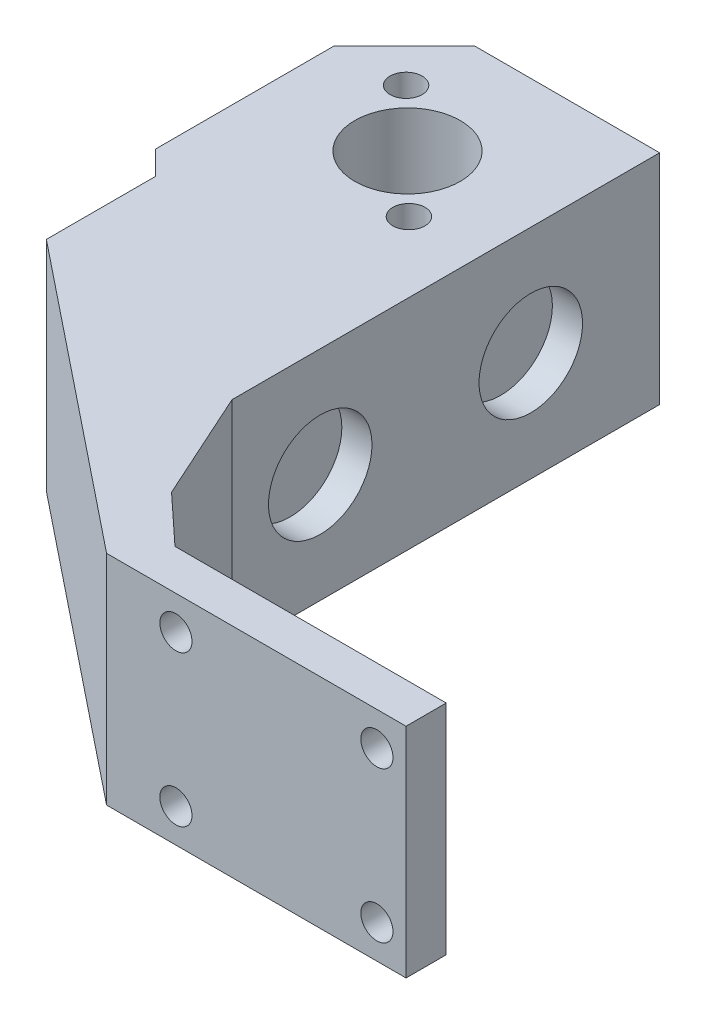
ISO-10303-21;
HEADER;
FILE_DESCRIPTION(('STEP AP214'),'2;1');
FILE_NAME('part.step','',(''),(''),'','','');
FILE_SCHEMA(('AUTOMOTIVE_DESIGN { 1 0 10303 214 1 1 1 1 }'));
ENDSEC;
DATA;
#1=APPLICATION_CONTEXT('core data for automotive mechanical design processes');
#2=APPLICATION_PROTOCOL_DEFINITION('international standard','automotive_design',2000,#1);
#3=PRODUCT_CONTEXT('',#1,'mechanical');
#4=PRODUCT('Part','Part','',(#3));
#5=PRODUCT_RELATED_PRODUCT_CATEGORY('part','',(#4));
#6=PRODUCT_DEFINITION_FORMATION('','',#4);
#7=PRODUCT_DEFINITION_CONTEXT('part definition',#1,'design');
#8=PRODUCT_DEFINITION('design','',#6,#7);
#9=PRODUCT_DEFINITION_SHAPE('','',#8);
#10=(LENGTH_UNIT() NAMED_UNIT(*) SI_UNIT(.MILLI.,.METRE.));
#11=(NAMED_UNIT(*) PLANE_ANGLE_UNIT() SI_UNIT($,.RADIAN.));
#12=(NAMED_UNIT(*) SI_UNIT($,.STERADIAN.) SOLID_ANGLE_UNIT());
#13=UNCERTAINTY_MEASURE_WITH_UNIT(LENGTH_MEASURE(1.E-05),#10,'distance_accuracy_value','');
#14=(GEOMETRIC_REPRESENTATION_CONTEXT(3) GLOBAL_UNCERTAINTY_ASSIGNED_CONTEXT((#13)) GLOBAL_UNIT_ASSIGNED_CONTEXT((#10,
#11,#12)) REPRESENTATION_CONTEXT('',''));
#15=CARTESIAN_POINT('',(0.,0.,0.));
#16=DIRECTION('',(0.,0.,1.));
#17=DIRECTION('',(1.,0.,0.));
#18=AXIS2_PLACEMENT_3D('',#15,#16,#17);
#19=CARTESIAN_POINT('',(0.,0.,4.));
#20=DIRECTION('',(0.,0.,1.));
#21=DIRECTION('',(1.,0.,0.));
#22=AXIS2_PLACEMENT_3D('',#19,#20,#21);
#23=PLANE('',#22);
#24=CARTESIAN_POINT('',(13.3119814523276,-16.5914088903663,4.));
#25=DIRECTION('',(0.,0.,1.));
#26=DIRECTION('',(1.,0.,0.));
#27=AXIS2_PLACEMENT_3D('',#24,#25,#26);
#28=CIRCLE('',#27,1.6);
#29=CARTESIAN_POINT('',(14.9119814523276,-16.5914088903663,4.));
#30=VERTEX_POINT('',#29);
#31=EDGE_CURVE('E183',#30,#30,#28,.T.);
#32=ORIENTED_EDGE('',*,*,#31,.F.);
#33=EDGE_LOOP('',(#32));
#34=FACE_BOUND('',#33,.T.);
#35=CARTESIAN_POINT('',(-6.68801854767252,-1.59140889036635,4.));
#36=DIRECTION('',(0.,0.,1.));
#37=DIRECTION('',(1.,0.,0.));
#38=AXIS2_PLACEMENT_3D('',#35,#36,#37);
#39=CIRCLE('',#38,1.6);
#40=CARTESIAN_POINT('',(-5.08801854767253,-1.59140889036635,4.));
#41=VERTEX_POINT('',#40);
#42=EDGE_CURVE('E195',#41,#41,#39,.T.);
#43=ORIENTED_EDGE('',*,*,#42,.F.);
#44=EDGE_LOOP('',(#43));
#45=FACE_BOUND('',#44,.T.);
#46=DIRECTION('',(0.,1.,0.));
#47=VECTOR('',#46,1.);
#48=CARTESIAN_POINT('',(16.2119814523275,-19.9414088903663,4.));
#49=LINE('',#48,#47);
#50=CARTESIAN_POINT('',(16.2119814523275,-19.9414088903663,4.));
#51=VERTEX_POINT('',#50);
#52=CARTESIAN_POINT('',(16.2119814523275,1.75859110963365,4.));
#53=VERTEX_POINT('',#52);
#54=EDGE_CURVE('E201',#51,#53,#49,.T.);
#55=ORIENTED_EDGE('',*,*,#54,.T.);
#56=DIRECTION('',(-1.,0.,0.));
#57=VECTOR('',#56,1.);
#58=CARTESIAN_POINT('',(16.2119814523275,1.75859110963365,4.));
#59=LINE('',#58,#57);
#60=CARTESIAN_POINT('',(-13.5880185476725,1.75859110963365,4.));
#61=VERTEX_POINT('',#60);
#62=EDGE_CURVE('E128',#53,#61,#59,.T.);
#63=ORIENTED_EDGE('',*,*,#62,.T.);
#64=DIRECTION('',(0.,1.,0.));
#65=VECTOR('',#64,1.);
#66=CARTESIAN_POINT('',(-13.5880185476725,-19.9414088903663,4.));
#67=LINE('',#66,#65);
#68=CARTESIAN_POINT('',(-13.5880185476725,-19.9414088903663,4.));
#69=VERTEX_POINT('',#68);
#70=EDGE_CURVE('E122',#69,#61,#67,.T.);
#71=ORIENTED_EDGE('',*,*,#70,.F.);
#72=DIRECTION('',(1.,0.,0.));
#73=VECTOR('',#72,1.);
#74=CARTESIAN_POINT('',(16.2119814523275,-19.9414088903663,4.));
#75=LINE('',#74,#73);
#76=EDGE_CURVE('E126',#69,#51,#75,.T.);
#77=ORIENTED_EDGE('',*,*,#76,.T.);
#78=EDGE_LOOP('',(#55,#63,#71,#77));
#79=FACE_BOUND('',#78,.T.);
#80=CARTESIAN_POINT('',(13.3119814523275,-1.59140889036635,4.));
#81=DIRECTION('',(0.,0.,1.));
#82=DIRECTION('',(1.,0.,0.));
#83=AXIS2_PLACEMENT_3D('',#80,#81,#82);
#84=CIRCLE('',#83,1.6);
#85=CARTESIAN_POINT('',(14.9119814523275,-1.59140889036635,4.));
#86=VERTEX_POINT('',#85);
#87=EDGE_CURVE('E189',#86,#86,#84,.T.);
#88=ORIENTED_EDGE('',*,*,#87,.F.);
#89=EDGE_LOOP('',(#88));
#90=FACE_BOUND('',#89,.T.);
#91=CARTESIAN_POINT('',(-6.68801854767237,-16.5914088903663,4.));
#92=DIRECTION('',(0.,0.,1.));
#93=DIRECTION('',(1.,0.,0.));
#94=AXIS2_PLACEMENT_3D('',#91,#92,#93);
#95=CIRCLE('',#94,1.6);
#96=CARTESIAN_POINT('',(-5.08801854767237,-16.5914088903663,4.));
#97=VERTEX_POINT('',#96);
#98=EDGE_CURVE('E177',#97,#97,#95,.T.);
#99=ORIENTED_EDGE('',*,*,#98,.F.);
#100=EDGE_LOOP('',(#99));
#101=FACE_BOUND('',#100,.T.);
#102=ADVANCED_FACE('F35',(#34,#45,#79,#90,#101),#23,.T.);
#103=CARTESIAN_POINT('',(0.,0.,0.));
#104=DIRECTION('',(0.,0.,1.));
#105=DIRECTION('',(1.,0.,0.));
#106=AXIS2_PLACEMENT_3D('',#103,#104,#105);
#107=PLANE('',#106);
#108=DIRECTION('',(1.,0.,0.));
#109=VECTOR('',#108,1.);
#110=CARTESIAN_POINT('',(16.2119814523275,-19.9414088903663,0.));
#111=LINE('',#110,#109);
#112=CARTESIAN_POINT('',(-10.783404097235,-19.9414088903663,0.));
#113=VERTEX_POINT('',#112);
#114=CARTESIAN_POINT('',(16.2119814523275,-19.9414088903663,0.));
#115=VERTEX_POINT('',#114);
#116=EDGE_CURVE('E203',#113,#115,#111,.T.);
#117=ORIENTED_EDGE('',*,*,#116,.F.);
#118=DIRECTION('',(0.,1.,0.));
#119=VECTOR('',#118,1.);
#120=CARTESIAN_POINT('',(-10.783404097235,-91.2750298070564,0.));
#121=LINE('',#120,#119);
#122=CARTESIAN_POINT('',(-10.783404097235,1.75859110963365,0.));
#123=VERTEX_POINT('',#122);
#124=EDGE_CURVE('E149',#113,#123,#121,.T.);
#125=ORIENTED_EDGE('',*,*,#124,.T.);
#126=DIRECTION('',(-1.,0.,0.));
#127=VECTOR('',#126,1.);
#128=CARTESIAN_POINT('',(16.2119814523275,1.75859110963365,0.));
#129=LINE('',#128,#127);
#130=CARTESIAN_POINT('',(16.2119814523275,1.75859110963365,0.));
#131=VERTEX_POINT('',#130);
#132=EDGE_CURVE('E207',#131,#123,#129,.T.);
#133=ORIENTED_EDGE('',*,*,#132,.F.);
#134=DIRECTION('',(0.,1.,0.));
#135=VECTOR('',#134,1.);
#136=CARTESIAN_POINT('',(16.2119814523275,-19.9414088903663,0.));
#137=LINE('',#136,#135);
#138=EDGE_CURVE('E198',#115,#131,#137,.T.);
#139=ORIENTED_EDGE('',*,*,#138,.F.);
#140=EDGE_LOOP('',(#117,#125,#133,#139));
#141=FACE_BOUND('',#140,.T.);
#142=CARTESIAN_POINT('',(-6.68801854767252,-1.59140889036635,0.));
#143=DIRECTION('',(0.,0.,1.));
#144=DIRECTION('',(1.,0.,0.));
#145=AXIS2_PLACEMENT_3D('',#142,#143,#144);
#146=CIRCLE('',#145,1.6);
#147=CARTESIAN_POINT('',(-5.08801854767253,-1.59140889036635,0.));
#148=VERTEX_POINT('',#147);
#149=EDGE_CURVE('E192',#148,#148,#146,.T.);
#150=ORIENTED_EDGE('',*,*,#149,.T.);
#151=EDGE_LOOP('',(#150));
#152=FACE_BOUND('',#151,.T.);
#153=CARTESIAN_POINT('',(13.3119814523275,-1.59140889036635,0.));
#154=DIRECTION('',(0.,0.,1.));
#155=DIRECTION('',(1.,0.,0.));
#156=AXIS2_PLACEMENT_3D('',#153,#154,#155);
#157=CIRCLE('',#156,1.6);
#158=CARTESIAN_POINT('',(14.9119814523275,-1.59140889036635,0.));
#159=VERTEX_POINT('',#158);
#160=EDGE_CURVE('E186',#159,#159,#157,.T.);
#161=ORIENTED_EDGE('',*,*,#160,.T.);
#162=EDGE_LOOP('',(#161));
#163=FACE_BOUND('',#162,.T.);
#164=CARTESIAN_POINT('',(13.3119814523276,-16.5914088903663,0.));
#165=DIRECTION('',(0.,0.,1.));
#166=DIRECTION('',(1.,0.,0.));
#167=AXIS2_PLACEMENT_3D('',#164,#165,#166);
#168=CIRCLE('',#167,1.6);
#169=CARTESIAN_POINT('',(14.9119814523276,-16.5914088903663,0.));
#170=VERTEX_POINT('',#169);
#171=EDGE_CURVE('E180',#170,#170,#168,.T.);
#172=ORIENTED_EDGE('',*,*,#171,.T.);
#173=EDGE_LOOP('',(#172));
#174=FACE_BOUND('',#173,.T.);
#175=CARTESIAN_POINT('',(-6.68801854767237,-16.5914088903663,0.));
#176=DIRECTION('',(0.,0.,1.));
#177=DIRECTION('',(1.,0.,0.));
#178=AXIS2_PLACEMENT_3D('',#175,#176,#177);
#179=CIRCLE('',#178,1.6);
#180=CARTESIAN_POINT('',(-5.08801854767237,-16.5914088903663,0.));
#181=VERTEX_POINT('',#180);
#182=EDGE_CURVE('E133',#181,#181,#179,.T.);
#183=ORIENTED_EDGE('',*,*,#182,.T.);
#184=EDGE_LOOP('',(#183));
#185=FACE_BOUND('',#184,.T.);
#186=ADVANCED_FACE('F282',(#141,#152,#163,#174,#185),#107,.F.);
#187=CARTESIAN_POINT('',(16.2119814523275,-19.9414088903663,4.));
#188=DIRECTION('',(-1.,0.,0.));
#189=DIRECTION('',(0.,0.,1.));
#190=AXIS2_PLACEMENT_3D('',#187,#188,#189);
#191=PLANE('',#190);
#192=ORIENTED_EDGE('',*,*,#138,.T.);
#193=DIRECTION('',(0.,0.,-1.));
#194=VECTOR('',#193,1.);
#195=CARTESIAN_POINT('',(16.2119814523275,1.75859110963365,4.));
#196=LINE('',#195,#194);
#197=EDGE_CURVE('E212',#53,#131,#196,.T.);
#198=ORIENTED_EDGE('',*,*,#197,.F.);
#199=ORIENTED_EDGE('',*,*,#54,.F.);
#200=DIRECTION('',(0.,0.,-1.));
#201=VECTOR('',#200,1.);
#202=CARTESIAN_POINT('',(16.2119814523275,-19.9414088903663,4.));
#203=LINE('',#202,#201);
#204=EDGE_CURVE('E142',#51,#115,#203,.T.);
#205=ORIENTED_EDGE('',*,*,#204,.T.);
#206=EDGE_LOOP('',(#192,#198,#199,#205));
#207=FACE_BOUND('',#206,.T.);
#208=ADVANCED_FACE('F305',(#207),#191,.F.);
#209=CARTESIAN_POINT('',(16.2119814523275,1.75859110963365,4.));
#210=DIRECTION('',(0.,-1.,0.));
#211=DIRECTION('',(0.,0.,-1.));
#212=AXIS2_PLACEMENT_3D('',#209,#210,#211);
#213=PLANE('',#212);
#214=DIRECTION('',(1.,0.,0.));
#215=VECTOR('',#214,1.);
#216=CARTESIAN_POINT('',(0.,1.75859110963365,-58.0376740014877));
#217=LINE('',#216,#215);
#218=CARTESIAN_POINT('',(-38.9943750803133,1.75859110963365,-58.0376740014877));
#219=VERTEX_POINT('',#218);
#220=CARTESIAN_POINT('',(-20.5891308746507,1.75859110963365,-58.0376740014877));
#221=VERTEX_POINT('',#220);
#222=EDGE_CURVE('E170',#219,#221,#217,.T.);
#223=ORIENTED_EDGE('',*,*,#222,.F.);
#224=DIRECTION('',(0.707106781186546,0.,-0.707106781186549));
#225=VECTOR('',#224,1.);
#226=CARTESIAN_POINT('',(-38.9943750803133,1.75859110963365,-58.0376740014877));
#227=LINE('',#226,#225);
#228=CARTESIAN_POINT('',(-45.9943750803133,1.75859110963365,-51.0376740014877));
#229=VERTEX_POINT('',#228);
#230=EDGE_CURVE('E57',#219,#229,#227,.F.);
#231=ORIENTED_EDGE('',*,*,#230,.T.);
#232=DIRECTION('',(0.,0.,-1.));
#233=VECTOR('',#232,1.);
#234=CARTESIAN_POINT('',(-45.9943750803133,1.75859110963365,0.));
#235=LINE('',#234,#233);
#236=CARTESIAN_POINT('',(-45.9943750803133,1.75859110963365,-33.2623259985122));
#237=VERTEX_POINT('',#236);
#238=EDGE_CURVE('E171',#237,#229,#235,.T.);
#239=ORIENTED_EDGE('',*,*,#238,.F.);
#240=DIRECTION('',(0.707106781186556,0.,0.707106781186539));
#241=VECTOR('',#240,1.);
#242=CARTESIAN_POINT('',(-6.36602454090001,1.75859110963365,6.36602454090016));
#243=LINE('',#242,#241);
#244=CARTESIAN_POINT('',(-43.6401523047004,1.75859110963365,-30.9081032228994));
#245=VERTEX_POINT('',#244);
#246=EDGE_CURVE('E162',#237,#245,#243,.T.);
#247=ORIENTED_EDGE('',*,*,#246,.T.);
#248=DIRECTION('',(0.,0.,-1.));
#249=VECTOR('',#248,1.);
#250=CARTESIAN_POINT('',(-43.6401523047004,1.75859110963365,0.));
#251=LINE('',#250,#249);
#252=CARTESIAN_POINT('',(-43.6401523047004,1.75859110963365,-20.0597806830785));
#253=VERTEX_POINT('',#252);
#254=EDGE_CURVE('E264',#253,#245,#251,.T.);
#255=ORIENTED_EDGE('',*,*,#254,.F.);
#256=DIRECTION('',(-0.780639739816673,0.,-0.624981277014725));
#257=VECTOR('',#256,1.);
#258=CARTESIAN_POINT('',(-7.25904262552515,1.75859110963365,9.06698705211705));
#259=LINE('',#258,#257);
#260=EDGE_CURVE('E148',#61,#253,#259,.T.);
#261=ORIENTED_EDGE('',*,*,#260,.F.);
#262=ORIENTED_EDGE('',*,*,#62,.F.);
#263=ORIENTED_EDGE('',*,*,#197,.T.);
#264=ORIENTED_EDGE('',*,*,#132,.T.);
#265=DIRECTION('',(-0.732304910686777,0.,-0.680976884911692));
#266=VECTOR('',#265,1.);
#267=CARTESIAN_POINT('',(-5.00058278208112,1.75859110963365,5.37749725247815));
#268=LINE('',#267,#266);
#269=CARTESIAN_POINT('',(-15.6228129695564,1.75859110963365,-4.50020958564489));
#270=VERTEX_POINT('',#269);
#271=EDGE_CURVE('E239',#123,#270,#268,.T.);
#272=ORIENTED_EDGE('',*,*,#271,.T.);
#273=DIRECTION('',(-0.411997316826914,0.,-0.911185058551458));
#274=VECTOR('',#273,1.);
#275=CARTESIAN_POINT('',(-11.2815639694392,1.75859110963365,5.10102096319401));
#276=LINE('',#275,#274);
#277=CARTESIAN_POINT('',(-20.5891308746507,1.75859110963365,-15.4838604161662));
#278=VERTEX_POINT('',#277);
#279=EDGE_CURVE('E237',#270,#278,#276,.T.);
#280=ORIENTED_EDGE('',*,*,#279,.T.);
#281=DIRECTION('',(0.,0.,1.));
#282=VECTOR('',#281,1.);
#283=CARTESIAN_POINT('',(-20.5891308746507,1.75859110963365,0.));
#284=LINE('',#283,#282);
#285=EDGE_CURVE('E230',#221,#278,#284,.T.);
#286=ORIENTED_EDGE('',*,*,#285,.F.);
#287=EDGE_LOOP('',(#223,#231,#239,#247,#255,#261,#262,#263,#264,#272,#280,#286));
#288=FACE_BOUND('',#287,.T.);
#289=CARTESIAN_POINT('',(-27.5643417870639,1.75859110963365,-40.064593922026));
#290=DIRECTION('',(0.,1.,0.));
#291=DIRECTION('',(0.,0.,1.));
#292=AXIS2_PLACEMENT_3D('',#289,#290,#291);
#293=CIRCLE('',#292,1.6);
#294=CARTESIAN_POINT('',(-27.5643417870639,1.75859110963365,-38.464593922026));
#295=VERTEX_POINT('',#294);
#296=EDGE_CURVE('E252',#295,#295,#293,.T.);
#297=ORIENTED_EDGE('',*,*,#296,.F.);
#298=EDGE_LOOP('',(#297));
#299=FACE_BOUND('',#298,.T.);
#300=CARTESIAN_POINT('',(-39.0191641678995,1.75859110963365,-51.2354060779751));
#301=DIRECTION('',(0.,1.,0.));
#302=DIRECTION('',(0.,0.,1.));
#303=AXIS2_PLACEMENT_3D('',#300,#301,#302);
#304=CIRCLE('',#303,1.6);
#305=CARTESIAN_POINT('',(-39.0191641678995,1.75859110963365,-49.6354060779751));
#306=VERTEX_POINT('',#305);
#307=EDGE_CURVE('E248',#306,#306,#304,.T.);
#308=ORIENTED_EDGE('',*,*,#307,.F.);
#309=EDGE_LOOP('',(#308));
#310=FACE_BOUND('',#309,.T.);
#311=CARTESIAN_POINT('',(-33.2917529774817,1.75859110963365,-45.6500000000003));
#312=DIRECTION('',(0.,1.,0.));
#313=DIRECTION('',(0.,0.,1.));
#314=AXIS2_PLACEMENT_3D('',#311,#312,#313);
#315=CIRCLE('',#314,5.25);
#316=CARTESIAN_POINT('',(-33.2917529774817,1.75859110963365,-40.4000000000003));
#317=VERTEX_POINT('',#316);
#318=EDGE_CURVE('E243',#317,#317,#315,.T.);
#319=ORIENTED_EDGE('',*,*,#318,.F.);
#320=EDGE_LOOP('',(#319));
#321=FACE_BOUND('',#320,.T.);
#322=ADVANCED_FACE('F226',(#288,#299,#310,#321),#213,.F.);
#323=CARTESIAN_POINT('',(16.2119814523275,-19.9414088903663,4.));
#324=DIRECTION('',(0.,1.,0.));
#325=DIRECTION('',(0.,0.,1.));
#326=AXIS2_PLACEMENT_3D('',#323,#324,#325);
#327=PLANE('',#326);
#328=DIRECTION('',(0.,0.,1.));
#329=VECTOR('',#328,1.);
#330=CARTESIAN_POINT('',(-45.9943750803133,-19.9414088903663,0.));
#331=LINE('',#330,#329);
#332=CARTESIAN_POINT('',(-45.9943750803133,-19.9414088903663,-51.0376740014877));
#333=VERTEX_POINT('',#332);
#334=CARTESIAN_POINT('',(-45.9943750803133,-19.9414088903663,-33.2623259985122));
#335=VERTEX_POINT('',#334);
#336=EDGE_CURVE('E163',#333,#335,#331,.T.);
#337=ORIENTED_EDGE('',*,*,#336,.F.);
#338=DIRECTION('',(-0.707106781186546,0.,0.707106781186549));
#339=VECTOR('',#338,1.);
#340=CARTESIAN_POINT('',(-38.9943750803133,-19.9414088903663,-58.0376740014877));
#341=LINE('',#340,#339);
#342=CARTESIAN_POINT('',(-38.9943750803133,-19.9414088903663,-58.0376740014877));
#343=VERTEX_POINT('',#342);
#344=EDGE_CURVE('E11',#333,#343,#341,.F.);
#345=ORIENTED_EDGE('',*,*,#344,.T.);
#346=DIRECTION('',(-1.,0.,0.));
#347=VECTOR('',#346,1.);
#348=CARTESIAN_POINT('',(0.,-19.9414088903663,-58.0376740014877));
#349=LINE('',#348,#347);
#350=CARTESIAN_POINT('',(-20.5891308746507,-19.9414088903663,-58.0376740014877));
#351=VERTEX_POINT('',#350);
#352=EDGE_CURVE('E167',#351,#343,#349,.T.);
#353=ORIENTED_EDGE('',*,*,#352,.F.);
#354=DIRECTION('',(0.,0.,-1.));
#355=VECTOR('',#354,1.);
#356=CARTESIAN_POINT('',(-20.5891308746507,-19.9414088903663,0.));
#357=LINE('',#356,#355);
#358=CARTESIAN_POINT('',(-20.5891308746507,-19.9414088903663,-15.4838604161662));
#359=VERTEX_POINT('',#358);
#360=EDGE_CURVE('E172',#359,#351,#357,.T.);
#361=ORIENTED_EDGE('',*,*,#360,.F.);
#362=DIRECTION('',(0.411997316826914,0.,0.911185058551458));
#363=VECTOR('',#362,1.);
#364=CARTESIAN_POINT('',(-11.2815639694392,-19.9414088903663,5.10102096319401));
#365=LINE('',#364,#363);
#366=CARTESIAN_POINT('',(-15.6228129695564,-19.9414088903663,-4.50020958564489));
#367=VERTEX_POINT('',#366);
#368=EDGE_CURVE('E161',#359,#367,#365,.T.);
#369=ORIENTED_EDGE('',*,*,#368,.T.);
#370=DIRECTION('',(0.732304910686777,0.,0.680976884911692));
#371=VECTOR('',#370,1.);
#372=CARTESIAN_POINT('',(-5.00058278208112,-19.9414088903663,5.37749725247815));
#373=LINE('',#372,#371);
#374=EDGE_CURVE('E134',#367,#113,#373,.T.);
#375=ORIENTED_EDGE('',*,*,#374,.T.);
#376=ORIENTED_EDGE('',*,*,#116,.T.);
#377=ORIENTED_EDGE('',*,*,#204,.F.);
#378=ORIENTED_EDGE('',*,*,#76,.F.);
#379=DIRECTION('',(0.780639739816673,0.,0.624981277014725));
#380=VECTOR('',#379,1.);
#381=CARTESIAN_POINT('',(-7.25904262552515,-19.9414088903663,9.06698705211705));
#382=LINE('',#381,#380);
#383=CARTESIAN_POINT('',(-43.6401523047004,-19.9414088903663,-20.0597806830785));
#384=VERTEX_POINT('',#383);
#385=EDGE_CURVE('E139',#384,#69,#382,.T.);
#386=ORIENTED_EDGE('',*,*,#385,.F.);
#387=DIRECTION('',(0.,0.,1.));
#388=VECTOR('',#387,1.);
#389=CARTESIAN_POINT('',(-43.6401523047004,-19.9414088903663,0.));
#390=LINE('',#389,#388);
#391=CARTESIAN_POINT('',(-43.6401523047004,-19.9414088903663,-30.9081032228994));
#392=VERTEX_POINT('',#391);
#393=EDGE_CURVE('E151',#392,#384,#390,.T.);
#394=ORIENTED_EDGE('',*,*,#393,.F.);
#395=DIRECTION('',(-0.707106781186556,0.,-0.707106781186539));
#396=VECTOR('',#395,1.);
#397=CARTESIAN_POINT('',(-6.36602454090001,-19.9414088903663,6.36602454090016));
#398=LINE('',#397,#396);
#399=EDGE_CURVE('E158',#392,#335,#398,.T.);
#400=ORIENTED_EDGE('',*,*,#399,.T.);
#401=EDGE_LOOP('',(#337,#345,#353,#361,#369,#375,#376,#377,#378,#386,#394,#400));
#402=FACE_BOUND('',#401,.T.);
#403=CARTESIAN_POINT('',(-39.0191641678995,-19.9414088903663,-51.2354060779751));
#404=DIRECTION('',(0.,1.,0.));
#405=DIRECTION('',(0.,0.,1.));
#406=AXIS2_PLACEMENT_3D('',#403,#404,#405);
#407=CIRCLE('',#406,1.6);
#408=CARTESIAN_POINT('',(-39.0191641678995,-19.9414088903663,-49.6354060779751));
#409=VERTEX_POINT('',#408);
#410=EDGE_CURVE('E246',#409,#409,#407,.F.);
#411=ORIENTED_EDGE('',*,*,#410,.F.);
#412=EDGE_LOOP('',(#411));
#413=FACE_BOUND('',#412,.T.);
#414=CARTESIAN_POINT('',(-27.5643417870639,-19.9414088903663,-40.064593922026));
#415=DIRECTION('',(0.,1.,0.));
#416=DIRECTION('',(0.,0.,1.));
#417=AXIS2_PLACEMENT_3D('',#414,#415,#416);
#418=CIRCLE('',#417,1.6);
#419=CARTESIAN_POINT('',(-27.5643417870639,-19.9414088903663,-38.464593922026));
#420=VERTEX_POINT('',#419);
#421=EDGE_CURVE('E251',#420,#420,#418,.F.);
#422=ORIENTED_EDGE('',*,*,#421,.F.);
#423=EDGE_LOOP('',(#422));
#424=FACE_BOUND('',#423,.T.);
#425=CARTESIAN_POINT('',(-33.2917529774817,-19.9414088903663,-45.6500000000003));
#426=DIRECTION('',(0.,1.,0.));
#427=DIRECTION('',(0.,0.,1.));
#428=AXIS2_PLACEMENT_3D('',#425,#426,#427);
#429=CIRCLE('',#428,5.25);
#430=CARTESIAN_POINT('',(-33.2917529774817,-19.9414088903663,-40.4000000000003));
#431=VERTEX_POINT('',#430);
#432=EDGE_CURVE('E247',#431,#431,#429,.F.);
#433=ORIENTED_EDGE('',*,*,#432,.F.);
#434=EDGE_LOOP('',(#433));
#435=FACE_BOUND('',#434,.T.);
#436=ADVANCED_FACE('F137',(#402,#413,#424,#435),#327,.F.);
#437=CARTESIAN_POINT('',(-6.68801854767252,-1.59140889036635,4.));
#438=DIRECTION('',(0.,0.,-1.));
#439=DIRECTION('',(-1.,0.,0.));
#440=AXIS2_PLACEMENT_3D('',#437,#438,#439);
#441=CYLINDRICAL_SURFACE('',#440,1.6);
#442=ORIENTED_EDGE('',*,*,#42,.T.);
#443=EDGE_LOOP('',(#442));
#444=FACE_BOUND('',#443,.T.);
#445=ORIENTED_EDGE('',*,*,#149,.F.);
#446=EDGE_LOOP('',(#445));
#447=FACE_BOUND('',#446,.T.);
#448=ADVANCED_FACE('F310',(#444,#447),#441,.F.);
#449=CARTESIAN_POINT('',(13.3119814523275,-1.59140889036635,4.));
#450=DIRECTION('',(0.,0.,-1.));
#451=DIRECTION('',(-1.,0.,0.));
#452=AXIS2_PLACEMENT_3D('',#449,#450,#451);
#453=CYLINDRICAL_SURFACE('',#452,1.6);
#454=ORIENTED_EDGE('',*,*,#87,.T.);
#455=EDGE_LOOP('',(#454));
#456=FACE_BOUND('',#455,.T.);
#457=ORIENTED_EDGE('',*,*,#160,.F.);
#458=EDGE_LOOP('',(#457));
#459=FACE_BOUND('',#458,.T.);
#460=ADVANCED_FACE('F338',(#456,#459),#453,.F.);
#461=CARTESIAN_POINT('',(13.3119814523276,-16.5914088903663,4.));
#462=DIRECTION('',(0.,0.,-1.));
#463=DIRECTION('',(-1.,0.,0.));
#464=AXIS2_PLACEMENT_3D('',#461,#462,#463);
#465=CYLINDRICAL_SURFACE('',#464,1.6);
#466=ORIENTED_EDGE('',*,*,#31,.T.);
#467=EDGE_LOOP('',(#466));
#468=FACE_BOUND('',#467,.T.);
#469=ORIENTED_EDGE('',*,*,#171,.F.);
#470=EDGE_LOOP('',(#469));
#471=FACE_BOUND('',#470,.T.);
#472=ADVANCED_FACE('F345',(#468,#471),#465,.F.);
#473=CARTESIAN_POINT('',(-6.68801854767237,-16.5914088903663,4.));
#474=DIRECTION('',(0.,0.,-1.));
#475=DIRECTION('',(-1.,0.,0.));
#476=AXIS2_PLACEMENT_3D('',#473,#474,#475);
#477=CYLINDRICAL_SURFACE('',#476,1.6);
#478=ORIENTED_EDGE('',*,*,#98,.T.);
#479=EDGE_LOOP('',(#478));
#480=FACE_BOUND('',#479,.T.);
#481=ORIENTED_EDGE('',*,*,#182,.F.);
#482=EDGE_LOOP('',(#481));
#483=FACE_BOUND('',#482,.T.);
#484=ADVANCED_FACE('F352',(#480,#483),#477,.F.);
#485=CARTESIAN_POINT('',(-7.25904262552515,-91.2750298070564,9.06698705211705));
#486=DIRECTION('',(0.624981277014725,0.,-0.780639739816673));
#487=DIRECTION('',(-0.780639739816673,0.,-0.624981277014725));
#488=AXIS2_PLACEMENT_3D('',#485,#486,#487);
#489=PLANE('',#488);
#490=DIRECTION('',(0.,1.,0.));
#491=VECTOR('',#490,1.);
#492=CARTESIAN_POINT('',(-43.6401523047004,-91.2750298070564,-20.0597806830785));
#493=LINE('',#492,#491);
#494=EDGE_CURVE('E147',#384,#253,#493,.T.);
#495=ORIENTED_EDGE('',*,*,#494,.F.);
#496=ORIENTED_EDGE('',*,*,#385,.T.);
#497=ORIENTED_EDGE('',*,*,#70,.T.);
#498=ORIENTED_EDGE('',*,*,#260,.T.);
#499=EDGE_LOOP('',(#495,#496,#497,#498));
#500=FACE_BOUND('',#499,.T.);
#501=ADVANCED_FACE('F146',(#500),#489,.F.);
#502=CARTESIAN_POINT('',(-43.6401523047004,-91.2750298070564,0.));
#503=DIRECTION('',(1.,0.,0.));
#504=DIRECTION('',(0.,0.,-1.));
#505=AXIS2_PLACEMENT_3D('',#502,#503,#504);
#506=PLANE('',#505);
#507=DIRECTION('',(0.,1.,0.));
#508=VECTOR('',#507,1.);
#509=CARTESIAN_POINT('',(-43.6401523047004,-91.2750298070564,-30.9081032228994));
#510=LINE('',#509,#508);
#511=EDGE_CURVE('E166',#392,#245,#510,.T.);
#512=ORIENTED_EDGE('',*,*,#511,.F.);
#513=ORIENTED_EDGE('',*,*,#393,.T.);
#514=ORIENTED_EDGE('',*,*,#494,.T.);
#515=ORIENTED_EDGE('',*,*,#254,.T.);
#516=EDGE_LOOP('',(#512,#513,#514,#515));
#517=FACE_BOUND('',#516,.T.);
#518=ADVANCED_FACE('F367',(#517),#506,.F.);
#519=CARTESIAN_POINT('',(-6.36602454090001,-91.2750298070564,6.36602454090016));
#520=DIRECTION('',(-0.707106781186539,0.,0.707106781186556));
#521=DIRECTION('',(0.707106781186556,0.,0.707106781186539));
#522=AXIS2_PLACEMENT_3D('',#519,#520,#521);
#523=PLANE('',#522);
#524=ORIENTED_EDGE('',*,*,#399,.F.);
#525=ORIENTED_EDGE('',*,*,#511,.T.);
#526=ORIENTED_EDGE('',*,*,#246,.F.);
#527=DIRECTION('',(0.,1.,0.));
#528=VECTOR('',#527,1.);
#529=CARTESIAN_POINT('',(-45.9943750803133,-91.2750298070564,-33.2623259985122));
#530=LINE('',#529,#528);
#531=EDGE_CURVE('E165',#335,#237,#530,.T.);
#532=ORIENTED_EDGE('',*,*,#531,.F.);
#533=EDGE_LOOP('',(#524,#525,#526,#532));
#534=FACE_BOUND('',#533,.T.);
#535=ADVANCED_FACE('F374',(#534),#523,.T.);
#536=CARTESIAN_POINT('',(-45.9943750803133,-91.2750298070564,0.));
#537=DIRECTION('',(1.,0.,0.));
#538=DIRECTION('',(0.,0.,-1.));
#539=AXIS2_PLACEMENT_3D('',#536,#537,#538);
#540=PLANE('',#539);
#541=ORIENTED_EDGE('',*,*,#238,.T.);
#542=DIRECTION('',(0.,-1.,0.));
#543=VECTOR('',#542,1.);
#544=CARTESIAN_POINT('',(-45.9943750803133,-91.2750298070564,-51.0376740014877));
#545=LINE('',#544,#543);
#546=EDGE_CURVE('E43',#229,#333,#545,.T.);
#547=ORIENTED_EDGE('',*,*,#546,.T.);
#548=ORIENTED_EDGE('',*,*,#336,.T.);
#549=ORIENTED_EDGE('',*,*,#531,.T.);
#550=EDGE_LOOP('',(#541,#547,#548,#549));
#551=FACE_BOUND('',#550,.T.);
#552=ADVANCED_FACE('F295',(#551),#540,.F.);
#553=CARTESIAN_POINT('',(0.,-91.2750298070564,-58.0376740014877));
#554=DIRECTION('',(0.,0.,1.));
#555=DIRECTION('',(1.,0.,0.));
#556=AXIS2_PLACEMENT_3D('',#553,#554,#555);
#557=PLANE('',#556);
#558=ORIENTED_EDGE('',*,*,#352,.T.);
#559=DIRECTION('',(0.,1.,0.));
#560=VECTOR('',#559,1.);
#561=CARTESIAN_POINT('',(-38.9943750803133,-91.2750298070564,-58.0376740014877));
#562=LINE('',#561,#560);
#563=EDGE_CURVE('E215',#343,#219,#562,.T.);
#564=ORIENTED_EDGE('',*,*,#563,.T.);
#565=ORIENTED_EDGE('',*,*,#222,.T.);
#566=DIRECTION('',(0.,1.,0.));
#567=VECTOR('',#566,1.);
#568=CARTESIAN_POINT('',(-20.5891308746507,-91.2750298070564,-58.0376740014877));
#569=LINE('',#568,#567);
#570=EDGE_CURVE('E175',#351,#221,#569,.T.);
#571=ORIENTED_EDGE('',*,*,#570,.F.);
#572=EDGE_LOOP('',(#558,#564,#565,#571));
#573=FACE_BOUND('',#572,.T.);
#574=ADVANCED_FACE('F220',(#573),#557,.F.);
#575=CARTESIAN_POINT('',(-20.5891308746507,-91.2750298070564,0.));
#576=DIRECTION('',(-1.,0.,0.));
#577=DIRECTION('',(0.,0.,1.));
#578=AXIS2_PLACEMENT_3D('',#575,#576,#577);
#579=PLANE('',#578);
#580=CARTESIAN_POINT('',(-20.5891308746507,-9.09140889036635,-24.263711451395));
#581=DIRECTION('',(1.,0.,0.));
#582=DIRECTION('',(0.,0.,-1.));
#583=AXIS2_PLACEMENT_3D('',#580,#581,#582);
#584=CIRCLE('',#583,5.15);
#585=CARTESIAN_POINT('',(-20.5891308746507,-9.09140889036635,-29.413711451395));
#586=VERTEX_POINT('',#585);
#587=EDGE_CURVE('E506',#586,#586,#584,.T.);
#588=ORIENTED_EDGE('',*,*,#587,.F.);
#589=EDGE_LOOP('',(#588));
#590=FACE_BOUND('',#589,.T.);
#591=CARTESIAN_POINT('',(-20.5891308746507,-9.09140889036635,-45.2162183072864));
#592=DIRECTION('',(1.,0.,0.));
#593=DIRECTION('',(0.,0.,-1.));
#594=AXIS2_PLACEMENT_3D('',#591,#592,#593);
#595=CIRCLE('',#594,5.15);
#596=CARTESIAN_POINT('',(-20.5891308746507,-9.09140889036635,-50.3662183072864));
#597=VERTEX_POINT('',#596);
#598=EDGE_CURVE('E514',#597,#597,#595,.T.);
#599=ORIENTED_EDGE('',*,*,#598,.F.);
#600=EDGE_LOOP('',(#599));
#601=FACE_BOUND('',#600,.T.);
#602=DIRECTION('',(0.,1.,0.));
#603=VECTOR('',#602,1.);
#604=CARTESIAN_POINT('',(-20.5891308746507,-91.2750298070564,-15.4838604161662));
#605=LINE('',#604,#603);
#606=EDGE_CURVE('E236',#359,#278,#605,.T.);
#607=ORIENTED_EDGE('',*,*,#606,.F.);
#608=ORIENTED_EDGE('',*,*,#360,.T.);
#609=ORIENTED_EDGE('',*,*,#570,.T.);
#610=ORIENTED_EDGE('',*,*,#285,.T.);
#611=EDGE_LOOP('',(#607,#608,#609,#610));
#612=FACE_BOUND('',#611,.T.);
#613=ADVANCED_FACE('F285',(#590,#601,#612),#579,.F.);
#614=CARTESIAN_POINT('',(-11.2815639694392,-91.2750298070564,5.10102096319401));
#615=DIRECTION('',(0.911185058551458,0.,-0.411997316826914));
#616=DIRECTION('',(-0.411997316826914,0.,-0.911185058551458));
#617=AXIS2_PLACEMENT_3D('',#614,#615,#616);
#618=PLANE('',#617);
#619=ORIENTED_EDGE('',*,*,#368,.F.);
#620=ORIENTED_EDGE('',*,*,#606,.T.);
#621=ORIENTED_EDGE('',*,*,#279,.F.);
#622=DIRECTION('',(0.,1.,0.));
#623=VECTOR('',#622,1.);
#624=CARTESIAN_POINT('',(-15.6228129695564,-91.2750298070564,-4.50020958564489));
#625=LINE('',#624,#623);
#626=EDGE_CURVE('E242',#367,#270,#625,.T.);
#627=ORIENTED_EDGE('',*,*,#626,.F.);
#628=EDGE_LOOP('',(#619,#620,#621,#627));
#629=FACE_BOUND('',#628,.T.);
#630=ADVANCED_FACE('F277',(#629),#618,.T.);
#631=CARTESIAN_POINT('',(-33.2917529774817,-91.2750298070564,-45.6500000000003));
#632=DIRECTION('',(0.,1.,0.));
#633=DIRECTION('',(0.,0.,1.));
#634=AXIS2_PLACEMENT_3D('',#631,#632,#633);
#635=CYLINDRICAL_SURFACE('',#634,5.25);
#636=ORIENTED_EDGE('',*,*,#432,.T.);
#637=EDGE_LOOP('',(#636));
#638=FACE_BOUND('',#637,.T.);
#639=ORIENTED_EDGE('',*,*,#318,.T.);
#640=EDGE_LOOP('',(#639));
#641=FACE_BOUND('',#640,.T.);
#642=ADVANCED_FACE('F293',(#638,#641),#635,.F.);
#643=CARTESIAN_POINT('',(-39.0191641678995,-91.2750298070564,-51.2354060779751));
#644=DIRECTION('',(0.,1.,0.));
#645=DIRECTION('',(0.,0.,1.));
#646=AXIS2_PLACEMENT_3D('',#643,#644,#645);
#647=CYLINDRICAL_SURFACE('',#646,1.6);
#648=ORIENTED_EDGE('',*,*,#410,.T.);
#649=EDGE_LOOP('',(#648));
#650=FACE_BOUND('',#649,.T.);
#651=ORIENTED_EDGE('',*,*,#307,.T.);
#652=EDGE_LOOP('',(#651));
#653=FACE_BOUND('',#652,.T.);
#654=ADVANCED_FACE('F457',(#650,#653),#647,.F.);
#655=CARTESIAN_POINT('',(-27.5643417870639,-91.2750298070564,-40.064593922026));
#656=DIRECTION('',(0.,1.,0.));
#657=DIRECTION('',(0.,0.,1.));
#658=AXIS2_PLACEMENT_3D('',#655,#656,#657);
#659=CYLINDRICAL_SURFACE('',#658,1.6);
#660=ORIENTED_EDGE('',*,*,#421,.T.);
#661=EDGE_LOOP('',(#660));
#662=FACE_BOUND('',#661,.T.);
#663=ORIENTED_EDGE('',*,*,#296,.T.);
#664=EDGE_LOOP('',(#663));
#665=FACE_BOUND('',#664,.T.);
#666=ADVANCED_FACE('F461',(#662,#665),#659,.F.);
#667=CARTESIAN_POINT('',(-5.00058278208112,-91.2750298070564,5.37749725247815));
#668=DIRECTION('',(0.680976884911692,0.,-0.732304910686777));
#669=DIRECTION('',(-0.732304910686777,0.,-0.680976884911692));
#670=AXIS2_PLACEMENT_3D('',#667,#668,#669);
#671=PLANE('',#670);
#672=ORIENTED_EDGE('',*,*,#374,.F.);
#673=ORIENTED_EDGE('',*,*,#626,.T.);
#674=ORIENTED_EDGE('',*,*,#271,.F.);
#675=ORIENTED_EDGE('',*,*,#124,.F.);
#676=EDGE_LOOP('',(#672,#673,#674,#675));
#677=FACE_BOUND('',#676,.T.);
#678=ADVANCED_FACE('F273',(#677),#671,.T.);
#679=CARTESIAN_POINT('',(-38.9943750803133,-91.2750298070564,-58.0376740014877));
#680=DIRECTION('',(0.707106781186549,0.,0.707106781186546));
#681=DIRECTION('',(0.,1.,0.));
#682=AXIS2_PLACEMENT_3D('',#679,#680,#681);
#683=PLANE('',#682);
#684=ORIENTED_EDGE('',*,*,#344,.F.);
#685=ORIENTED_EDGE('',*,*,#546,.F.);
#686=ORIENTED_EDGE('',*,*,#230,.F.);
#687=ORIENTED_EDGE('',*,*,#563,.F.);
#688=EDGE_LOOP('',(#684,#685,#686,#687));
#689=FACE_BOUND('',#688,.T.);
#690=ADVANCED_FACE('F37',(#689),#683,.F.);
#691=CARTESIAN_POINT('',(-23.5891308746507,-9.09140889036635,-45.2162183072864));
#692=DIRECTION('',(1.,0.,0.));
#693=DIRECTION('',(0.,0.,-1.));
#694=AXIS2_PLACEMENT_3D('',#691,#692,#693);
#695=CYLINDRICAL_SURFACE('',#694,5.15);
#696=CARTESIAN_POINT('',(-23.5891308746507,-9.09140889036635,-45.2162183072864));
#697=DIRECTION('',(1.,0.,0.));
#698=DIRECTION('',(0.,0.,-1.));
#699=AXIS2_PLACEMENT_3D('',#696,#697,#698);
#700=CIRCLE('',#699,5.15);
#701=CARTESIAN_POINT('',(-23.5891308746507,-9.09140889036635,-50.3662183072864));
#702=VERTEX_POINT('',#701);
#703=EDGE_CURVE('E509',#702,#702,#700,.T.);
#704=ORIENTED_EDGE('',*,*,#703,.F.);
#705=EDGE_LOOP('',(#704));
#706=FACE_BOUND('',#705,.T.);
#707=ORIENTED_EDGE('',*,*,#598,.T.);
#708=EDGE_LOOP('',(#707));
#709=FACE_BOUND('',#708,.T.);
#710=ADVANCED_FACE('F403',(#706,#709),#695,.F.);
#711=CARTESIAN_POINT('',(-23.5891308746507,-9.09140889036635,-45.2162183072864));
#712=DIRECTION('',(1.,0.,0.));
#713=DIRECTION('',(0.,0.,-1.));
#714=AXIS2_PLACEMENT_3D('',#711,#712,#713);
#715=PLANE('',#714);
#716=ORIENTED_EDGE('',*,*,#703,.T.);
#717=EDGE_LOOP('',(#716));
#718=FACE_BOUND('',#717,.T.);
#719=ADVANCED_FACE('F419',(#718),#715,.T.);
#720=CARTESIAN_POINT('',(-23.5891308746507,-9.09140889036635,-24.263711451395));
#721=DIRECTION('',(1.,0.,0.));
#722=DIRECTION('',(0.,0.,-1.));
#723=AXIS2_PLACEMENT_3D('',#720,#721,#722);
#724=CYLINDRICAL_SURFACE('',#723,5.15);
#725=CARTESIAN_POINT('',(-23.5891308746507,-9.09140889036635,-24.263711451395));
#726=DIRECTION('',(1.,0.,0.));
#727=DIRECTION('',(0.,0.,-1.));
#728=AXIS2_PLACEMENT_3D('',#725,#726,#727);
#729=CIRCLE('',#728,5.15);
#730=CARTESIAN_POINT('',(-23.5891308746507,-9.09140889036635,-29.413711451395));
#731=VERTEX_POINT('',#730);
#732=EDGE_CURVE('E153',#731,#731,#729,.T.);
#733=ORIENTED_EDGE('',*,*,#732,.F.);
#734=EDGE_LOOP('',(#733));
#735=FACE_BOUND('',#734,.T.);
#736=ORIENTED_EDGE('',*,*,#587,.T.);
#737=EDGE_LOOP('',(#736));
#738=FACE_BOUND('',#737,.T.);
#739=ADVANCED_FACE('F429',(#735,#738),#724,.F.);
#740=CARTESIAN_POINT('',(-23.5891308746507,-9.09140889036635,-24.263711451395));
#741=DIRECTION('',(1.,0.,0.));
#742=DIRECTION('',(0.,0.,-1.));
#743=AXIS2_PLACEMENT_3D('',#740,#741,#742);
#744=PLANE('',#743);
#745=ORIENTED_EDGE('',*,*,#732,.T.);
#746=EDGE_LOOP('',(#745));
#747=FACE_BOUND('',#746,.T.);
#748=ADVANCED_FACE('F439',(#747),#744,.T.);
#749=CLOSED_SHELL('',(#102,#186,#208,#322,#436,#448,#460,#472,#484,#501,#518,#535,#552,#574,
#613,#630,#642,#654,#666,#678,#690,#710,#719,#739,#748));
#750=MANIFOLD_SOLID_BREP('B2',#749);
#751=ADVANCED_BREP_SHAPE_REPRESENTATION('',(#18,#750),#14);
#752=SHAPE_DEFINITION_REPRESENTATION(#9,#751);
ENDSEC;
END-ISO-10303-21;
